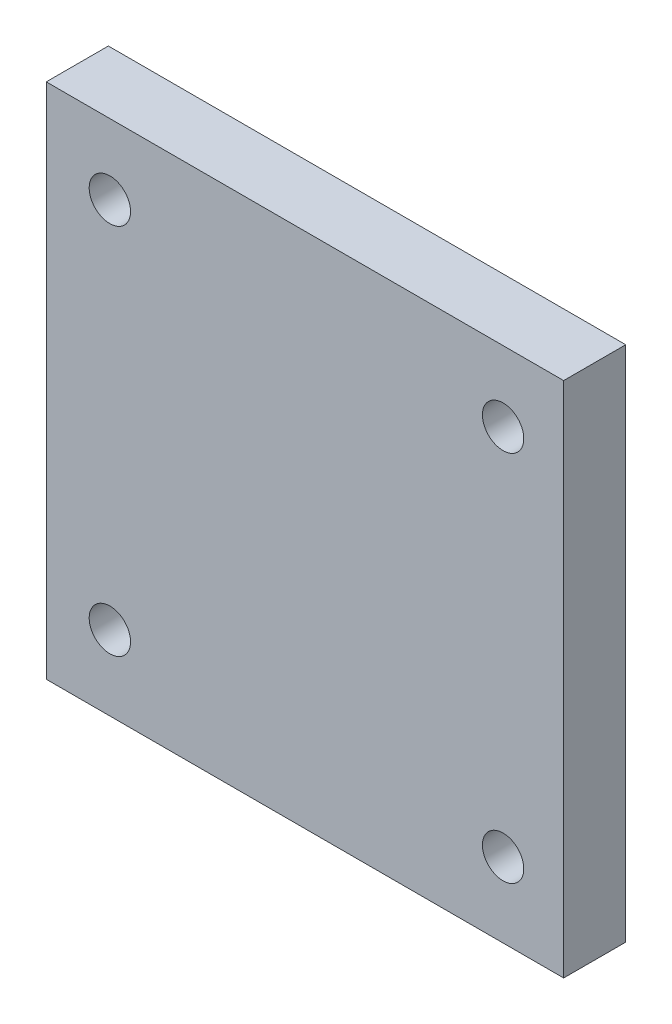
ISO-10303-21;
HEADER;
FILE_DESCRIPTION(('STEP AP214'),'2;1');
FILE_NAME('part.step','',(''),(''),'','','');
FILE_SCHEMA(('AUTOMOTIVE_DESIGN { 1 0 10303 214 1 1 1 1 }'));
ENDSEC;
DATA;
#1=APPLICATION_CONTEXT('core data for automotive mechanical design processes');
#2=APPLICATION_PROTOCOL_DEFINITION('international standard','automotive_design',2000,#1);
#3=PRODUCT_CONTEXT('',#1,'mechanical');
#4=PRODUCT('Part','Part','',(#3));
#5=PRODUCT_RELATED_PRODUCT_CATEGORY('part','',(#4));
#6=PRODUCT_DEFINITION_FORMATION('','',#4);
#7=PRODUCT_DEFINITION_CONTEXT('part definition',#1,'design');
#8=PRODUCT_DEFINITION('design','',#6,#7);
#9=PRODUCT_DEFINITION_SHAPE('','',#8);
#10=(LENGTH_UNIT() NAMED_UNIT(*) SI_UNIT(.MILLI.,.METRE.));
#11=(NAMED_UNIT(*) PLANE_ANGLE_UNIT() SI_UNIT($,.RADIAN.));
#12=(NAMED_UNIT(*) SI_UNIT($,.STERADIAN.) SOLID_ANGLE_UNIT());
#13=UNCERTAINTY_MEASURE_WITH_UNIT(LENGTH_MEASURE(1.E-05),#10,'distance_accuracy_value','');
#14=(GEOMETRIC_REPRESENTATION_CONTEXT(3) GLOBAL_UNCERTAINTY_ASSIGNED_CONTEXT((#13)) GLOBAL_UNIT_ASSIGNED_CONTEXT((#10,
#11,#12)) REPRESENTATION_CONTEXT('',''));
#15=CARTESIAN_POINT('',(0.,0.,0.));
#16=DIRECTION('',(0.,0.,1.));
#17=DIRECTION('',(1.,0.,0.));
#18=AXIS2_PLACEMENT_3D('',#15,#16,#17);
#19=CARTESIAN_POINT('',(0.,0.,3.));
#20=DIRECTION('',(0.,0.,-1.));
#21=DIRECTION('',(-1.,0.,0.));
#22=AXIS2_PLACEMENT_3D('',#19,#20,#21);
#23=PLANE('',#22);
#24=CARTESIAN_POINT('',(-10.741583439626,8.79038550730753,3.));
#25=DIRECTION('',(0.,0.,1.));
#26=DIRECTION('',(-1.,0.,0.));
#27=AXIS2_PLACEMENT_3D('',#24,#25,#26);
#28=CIRCLE('',#27,0.999999999999992);
#29=CARTESIAN_POINT('',(-11.741583439626,8.79038550730753,3.));
#30=VERTEX_POINT('',#29);
#31=EDGE_CURVE('E121',#30,#30,#28,.T.);
#32=ORIENTED_EDGE('',*,*,#31,.F.);
#33=EDGE_LOOP('',(#32));
#34=FACE_BOUND('',#33,.T.);
#35=CARTESIAN_POINT('',(8.25841656037399,-9.20961449269248,3.));
#36=DIRECTION('',(0.,0.,1.));
#37=DIRECTION('',(-1.,0.,0.));
#38=AXIS2_PLACEMENT_3D('',#35,#36,#37);
#39=CIRCLE('',#38,0.999999999999998);
#40=CARTESIAN_POINT('',(7.25841656037399,-9.20961449269248,3.));
#41=VERTEX_POINT('',#40);
#42=EDGE_CURVE('E100',#41,#41,#39,.T.);
#43=ORIENTED_EDGE('',*,*,#42,.F.);
#44=EDGE_LOOP('',(#43));
#45=FACE_BOUND('',#44,.T.);
#46=DIRECTION('',(0.,1.,0.));
#47=VECTOR('',#46,1.);
#48=CARTESIAN_POINT('',(11.1848702517883,-12.8134309531199,3.));
#49=LINE('',#48,#47);
#50=CARTESIAN_POINT('',(11.1848702517883,-12.8134309531199,3.));
#51=VERTEX_POINT('',#50);
#52=CARTESIAN_POINT('',(11.1848702517883,12.1865690468801,3.));
#53=VERTEX_POINT('',#52);
#54=EDGE_CURVE('E85',#51,#53,#49,.T.);
#55=ORIENTED_EDGE('',*,*,#54,.T.);
#56=DIRECTION('',(-1.,0.,0.));
#57=VECTOR('',#56,1.);
#58=CARTESIAN_POINT('',(-13.8151297482117,12.1865690468801,3.));
#59=LINE('',#58,#57);
#60=CARTESIAN_POINT('',(-13.8151297482117,12.1865690468801,3.));
#61=VERTEX_POINT('',#60);
#62=EDGE_CURVE('E80',#53,#61,#59,.T.);
#63=ORIENTED_EDGE('',*,*,#62,.T.);
#64=DIRECTION('',(0.,-1.,0.));
#65=VECTOR('',#64,1.);
#66=CARTESIAN_POINT('',(-13.8151297482117,-12.8134309531199,3.));
#67=LINE('',#66,#65);
#68=CARTESIAN_POINT('',(-13.8151297482117,-12.8134309531199,3.));
#69=VERTEX_POINT('',#68);
#70=EDGE_CURVE('E83',#61,#69,#67,.T.);
#71=ORIENTED_EDGE('',*,*,#70,.T.);
#72=DIRECTION('',(1.,0.,0.));
#73=VECTOR('',#72,1.);
#74=CARTESIAN_POINT('',(-13.8151297482117,-12.8134309531199,3.));
#75=LINE('',#74,#73);
#76=EDGE_CURVE('E50',#69,#51,#75,.T.);
#77=ORIENTED_EDGE('',*,*,#76,.T.);
#78=EDGE_LOOP('',(#55,#63,#71,#77));
#79=FACE_BOUND('',#78,.T.);
#80=CARTESIAN_POINT('',(-10.741583439626,-9.20961449269248,3.));
#81=DIRECTION('',(0.,0.,1.));
#82=DIRECTION('',(-1.,0.,0.));
#83=AXIS2_PLACEMENT_3D('',#80,#81,#82);
#84=CIRCLE('',#83,0.999999999999998);
#85=CARTESIAN_POINT('',(-11.741583439626,-9.20961449269248,3.));
#86=VERTEX_POINT('',#85);
#87=EDGE_CURVE('E115',#86,#86,#84,.T.);
#88=ORIENTED_EDGE('',*,*,#87,.F.);
#89=EDGE_LOOP('',(#88));
#90=FACE_BOUND('',#89,.T.);
#91=CARTESIAN_POINT('',(8.258416560374,8.79038550730753,3.));
#92=DIRECTION('',(0.,0.,1.));
#93=DIRECTION('',(-1.,0.,0.));
#94=AXIS2_PLACEMENT_3D('',#91,#92,#93);
#95=CIRCLE('',#94,0.999999999999998);
#96=CARTESIAN_POINT('',(7.258416560374,8.79038550730753,3.));
#97=VERTEX_POINT('',#96);
#98=EDGE_CURVE('E127',#97,#97,#95,.T.);
#99=ORIENTED_EDGE('',*,*,#98,.F.);
#100=EDGE_LOOP('',(#99));
#101=FACE_BOUND('',#100,.T.);
#102=ADVANCED_FACE('F33',(#34,#45,#79,#90,#101),#23,.F.);
#103=CARTESIAN_POINT('',(0.,0.,0.));
#104=DIRECTION('',(0.,0.,-1.));
#105=DIRECTION('',(-1.,0.,0.));
#106=AXIS2_PLACEMENT_3D('',#103,#104,#105);
#107=PLANE('',#106);
#108=CARTESIAN_POINT('',(-10.741583439626,8.79038550730753,0.));
#109=DIRECTION('',(0.,0.,1.));
#110=DIRECTION('',(-1.,0.,0.));
#111=AXIS2_PLACEMENT_3D('',#108,#109,#110);
#112=CIRCLE('',#111,0.999999999999992);
#113=CARTESIAN_POINT('',(-11.741583439626,8.79038550730753,0.));
#114=VERTEX_POINT('',#113);
#115=EDGE_CURVE('E124',#114,#114,#112,.T.);
#116=ORIENTED_EDGE('',*,*,#115,.T.);
#117=EDGE_LOOP('',(#116));
#118=FACE_BOUND('',#117,.T.);
#119=CARTESIAN_POINT('',(8.25841656037399,-9.20961449269248,0.));
#120=DIRECTION('',(0.,0.,1.));
#121=DIRECTION('',(-1.,0.,0.));
#122=AXIS2_PLACEMENT_3D('',#119,#120,#121);
#123=CIRCLE('',#122,0.999999999999998);
#124=CARTESIAN_POINT('',(7.25841656037399,-9.20961449269248,0.));
#125=VERTEX_POINT('',#124);
#126=EDGE_CURVE('E112',#125,#125,#123,.T.);
#127=ORIENTED_EDGE('',*,*,#126,.T.);
#128=EDGE_LOOP('',(#127));
#129=FACE_BOUND('',#128,.T.);
#130=DIRECTION('',(0.,1.,0.));
#131=VECTOR('',#130,1.);
#132=CARTESIAN_POINT('',(11.1848702517883,-12.8134309531199,0.));
#133=LINE('',#132,#131);
#134=CARTESIAN_POINT('',(11.1848702517883,-12.8134309531199,0.));
#135=VERTEX_POINT('',#134);
#136=CARTESIAN_POINT('',(11.1848702517883,12.1865690468801,0.));
#137=VERTEX_POINT('',#136);
#138=EDGE_CURVE('E97',#135,#137,#133,.T.);
#139=ORIENTED_EDGE('',*,*,#138,.F.);
#140=DIRECTION('',(1.,0.,0.));
#141=VECTOR('',#140,1.);
#142=CARTESIAN_POINT('',(-13.8151297482117,-12.8134309531199,0.));
#143=LINE('',#142,#141);
#144=CARTESIAN_POINT('',(-13.8151297482117,-12.8134309531199,0.));
#145=VERTEX_POINT('',#144);
#146=EDGE_CURVE('E73',#145,#135,#143,.T.);
#147=ORIENTED_EDGE('',*,*,#146,.F.);
#148=DIRECTION('',(0.,-1.,0.));
#149=VECTOR('',#148,1.);
#150=CARTESIAN_POINT('',(-13.8151297482117,-12.8134309531199,0.));
#151=LINE('',#150,#149);
#152=CARTESIAN_POINT('',(-13.8151297482117,12.1865690468801,0.));
#153=VERTEX_POINT('',#152);
#154=EDGE_CURVE('E67',#153,#145,#151,.T.);
#155=ORIENTED_EDGE('',*,*,#154,.F.);
#156=DIRECTION('',(-1.,0.,0.));
#157=VECTOR('',#156,1.);
#158=CARTESIAN_POINT('',(-13.8151297482117,12.1865690468801,0.));
#159=LINE('',#158,#157);
#160=EDGE_CURVE('E89',#137,#153,#159,.T.);
#161=ORIENTED_EDGE('',*,*,#160,.F.);
#162=EDGE_LOOP('',(#139,#147,#155,#161));
#163=FACE_BOUND('',#162,.T.);
#164=CARTESIAN_POINT('',(-10.741583439626,-9.20961449269248,0.));
#165=DIRECTION('',(0.,0.,1.));
#166=DIRECTION('',(-1.,0.,0.));
#167=AXIS2_PLACEMENT_3D('',#164,#165,#166);
#168=CIRCLE('',#167,0.999999999999998);
#169=CARTESIAN_POINT('',(-11.741583439626,-9.20961449269248,0.));
#170=VERTEX_POINT('',#169);
#171=EDGE_CURVE('E118',#170,#170,#168,.T.);
#172=ORIENTED_EDGE('',*,*,#171,.T.);
#173=EDGE_LOOP('',(#172));
#174=FACE_BOUND('',#173,.T.);
#175=CARTESIAN_POINT('',(8.258416560374,8.79038550730753,0.));
#176=DIRECTION('',(0.,0.,1.));
#177=DIRECTION('',(-1.,0.,0.));
#178=AXIS2_PLACEMENT_3D('',#175,#176,#177);
#179=CIRCLE('',#178,0.999999999999998);
#180=CARTESIAN_POINT('',(7.258416560374,8.79038550730753,0.));
#181=VERTEX_POINT('',#180);
#182=EDGE_CURVE('E130',#181,#181,#179,.T.);
#183=ORIENTED_EDGE('',*,*,#182,.T.);
#184=EDGE_LOOP('',(#183));
#185=FACE_BOUND('',#184,.T.);
#186=ADVANCED_FACE('F108',(#118,#129,#163,#174,#185),#107,.T.);
#187=CARTESIAN_POINT('',(11.1848702517883,-12.8134309531199,3.));
#188=DIRECTION('',(-1.,0.,0.));
#189=DIRECTION('',(0.,0.,1.));
#190=AXIS2_PLACEMENT_3D('',#187,#188,#189);
#191=PLANE('',#190);
#192=ORIENTED_EDGE('',*,*,#138,.T.);
#193=DIRECTION('',(0.,0.,-1.));
#194=VECTOR('',#193,1.);
#195=CARTESIAN_POINT('',(11.1848702517883,12.1865690468801,3.));
#196=LINE('',#195,#194);
#197=EDGE_CURVE('E11',#53,#137,#196,.T.);
#198=ORIENTED_EDGE('',*,*,#197,.F.);
#199=ORIENTED_EDGE('',*,*,#54,.F.);
#200=DIRECTION('',(0.,0.,-1.));
#201=VECTOR('',#200,1.);
#202=CARTESIAN_POINT('',(11.1848702517883,-12.8134309531199,3.));
#203=LINE('',#202,#201);
#204=EDGE_CURVE('E93',#51,#135,#203,.T.);
#205=ORIENTED_EDGE('',*,*,#204,.T.);
#206=EDGE_LOOP('',(#192,#198,#199,#205));
#207=FACE_BOUND('',#206,.T.);
#208=ADVANCED_FACE('F35',(#207),#191,.F.);
#209=CARTESIAN_POINT('',(-13.8151297482117,12.1865690468801,3.));
#210=DIRECTION('',(0.,-1.,0.));
#211=DIRECTION('',(0.,0.,-1.));
#212=AXIS2_PLACEMENT_3D('',#209,#210,#211);
#213=PLANE('',#212);
#214=ORIENTED_EDGE('',*,*,#160,.T.);
#215=DIRECTION('',(0.,0.,-1.));
#216=VECTOR('',#215,1.);
#217=CARTESIAN_POINT('',(-13.8151297482117,12.1865690468801,3.));
#218=LINE('',#217,#216);
#219=EDGE_CURVE('E42',#61,#153,#218,.T.);
#220=ORIENTED_EDGE('',*,*,#219,.F.);
#221=ORIENTED_EDGE('',*,*,#62,.F.);
#222=ORIENTED_EDGE('',*,*,#197,.T.);
#223=EDGE_LOOP('',(#214,#220,#221,#222));
#224=FACE_BOUND('',#223,.T.);
#225=ADVANCED_FACE('F88',(#224),#213,.F.);
#226=CARTESIAN_POINT('',(-13.8151297482117,-12.8134309531199,3.));
#227=DIRECTION('',(1.,0.,0.));
#228=DIRECTION('',(0.,0.,-1.));
#229=AXIS2_PLACEMENT_3D('',#226,#227,#228);
#230=PLANE('',#229);
#231=ORIENTED_EDGE('',*,*,#154,.T.);
#232=DIRECTION('',(0.,0.,-1.));
#233=VECTOR('',#232,1.);
#234=CARTESIAN_POINT('',(-13.8151297482117,-12.8134309531199,3.));
#235=LINE('',#234,#233);
#236=EDGE_CURVE('E90',#69,#145,#235,.T.);
#237=ORIENTED_EDGE('',*,*,#236,.F.);
#238=ORIENTED_EDGE('',*,*,#70,.F.);
#239=ORIENTED_EDGE('',*,*,#219,.T.);
#240=EDGE_LOOP('',(#231,#237,#238,#239));
#241=FACE_BOUND('',#240,.T.);
#242=ADVANCED_FACE('F91',(#241),#230,.F.);
#243=CARTESIAN_POINT('',(-13.8151297482117,-12.8134309531199,3.));
#244=DIRECTION('',(0.,1.,0.));
#245=DIRECTION('',(0.,0.,1.));
#246=AXIS2_PLACEMENT_3D('',#243,#244,#245);
#247=PLANE('',#246);
#248=ORIENTED_EDGE('',*,*,#146,.T.);
#249=ORIENTED_EDGE('',*,*,#204,.F.);
#250=ORIENTED_EDGE('',*,*,#76,.F.);
#251=ORIENTED_EDGE('',*,*,#236,.T.);
#252=EDGE_LOOP('',(#248,#249,#250,#251));
#253=FACE_BOUND('',#252,.T.);
#254=ADVANCED_FACE('F105',(#253),#247,.F.);
#255=CARTESIAN_POINT('',(8.25841656037399,-9.20961449269248,3.));
#256=DIRECTION('',(0.,0.,-1.));
#257=DIRECTION('',(-1.,0.,0.));
#258=AXIS2_PLACEMENT_3D('',#255,#256,#257);
#259=CYLINDRICAL_SURFACE('',#258,0.999999999999998);
#260=ORIENTED_EDGE('',*,*,#42,.T.);
#261=EDGE_LOOP('',(#260));
#262=FACE_BOUND('',#261,.T.);
#263=ORIENTED_EDGE('',*,*,#126,.F.);
#264=EDGE_LOOP('',(#263));
#265=FACE_BOUND('',#264,.T.);
#266=ADVANCED_FACE('F150',(#262,#265),#259,.F.);
#267=CARTESIAN_POINT('',(-10.741583439626,-9.20961449269248,3.));
#268=DIRECTION('',(0.,0.,-1.));
#269=DIRECTION('',(-1.,0.,0.));
#270=AXIS2_PLACEMENT_3D('',#267,#268,#269);
#271=CYLINDRICAL_SURFACE('',#270,0.999999999999998);
#272=ORIENTED_EDGE('',*,*,#87,.T.);
#273=EDGE_LOOP('',(#272));
#274=FACE_BOUND('',#273,.T.);
#275=ORIENTED_EDGE('',*,*,#171,.F.);
#276=EDGE_LOOP('',(#275));
#277=FACE_BOUND('',#276,.T.);
#278=ADVANCED_FACE('F196',(#274,#277),#271,.F.);
#279=CARTESIAN_POINT('',(-10.741583439626,8.79038550730753,3.));
#280=DIRECTION('',(0.,0.,-1.));
#281=DIRECTION('',(-1.,0.,0.));
#282=AXIS2_PLACEMENT_3D('',#279,#280,#281);
#283=CYLINDRICAL_SURFACE('',#282,0.999999999999992);
#284=ORIENTED_EDGE('',*,*,#31,.T.);
#285=EDGE_LOOP('',(#284));
#286=FACE_BOUND('',#285,.T.);
#287=ORIENTED_EDGE('',*,*,#115,.F.);
#288=EDGE_LOOP('',(#287));
#289=FACE_BOUND('',#288,.T.);
#290=ADVANCED_FACE('F204',(#286,#289),#283,.F.);
#291=CARTESIAN_POINT('',(8.258416560374,8.79038550730753,3.));
#292=DIRECTION('',(0.,0.,-1.));
#293=DIRECTION('',(-1.,0.,0.));
#294=AXIS2_PLACEMENT_3D('',#291,#292,#293);
#295=CYLINDRICAL_SURFACE('',#294,0.999999999999998);
#296=ORIENTED_EDGE('',*,*,#98,.T.);
#297=EDGE_LOOP('',(#296));
#298=FACE_BOUND('',#297,.T.);
#299=ORIENTED_EDGE('',*,*,#182,.F.);
#300=EDGE_LOOP('',(#299));
#301=FACE_BOUND('',#300,.T.);
#302=ADVANCED_FACE('F136',(#298,#301),#295,.F.);
#303=CLOSED_SHELL('',(#102,#186,#208,#225,#242,#254,#266,#278,#290,#302));
#304=MANIFOLD_SOLID_BREP('B2',#303);
#305=ADVANCED_BREP_SHAPE_REPRESENTATION('',(#18,#304),#14);
#306=SHAPE_DEFINITION_REPRESENTATION(#9,#305);
ENDSEC;
END-ISO-10303-21;
